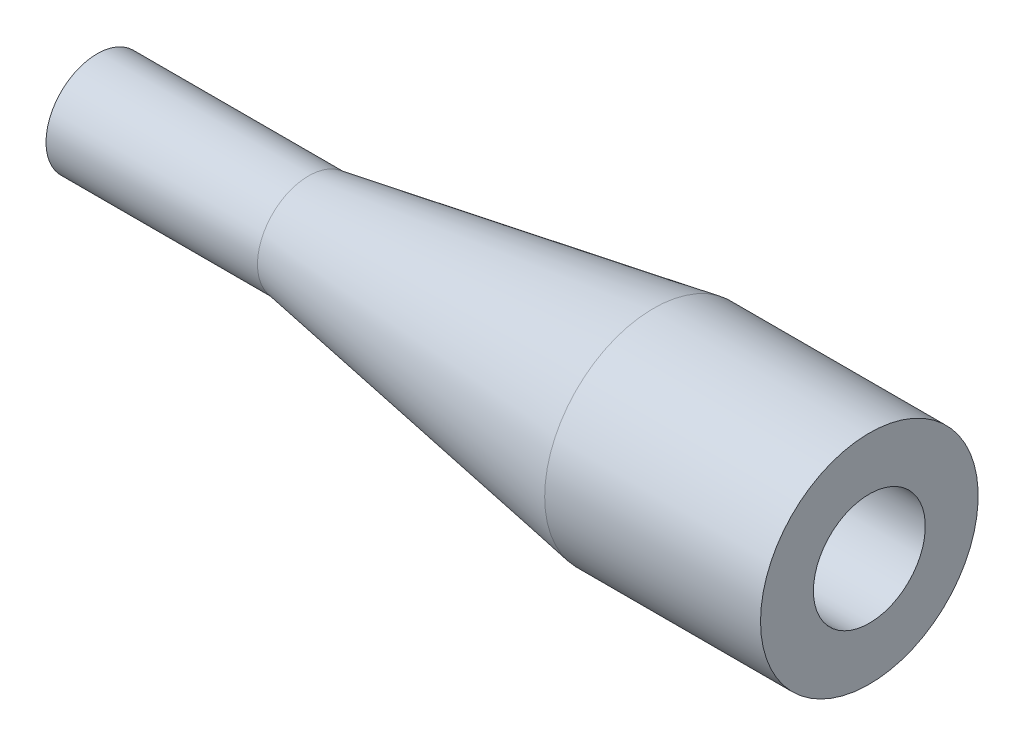
ISO-10303-21;
HEADER;
FILE_DESCRIPTION(('STEP AP214'),'2;1');
FILE_NAME('part.step','',(''),(''),'','','');
FILE_SCHEMA(('AUTOMOTIVE_DESIGN { 1 0 10303 214 1 1 1 1 }'));
ENDSEC;
DATA;
#1=APPLICATION_CONTEXT('core data for automotive mechanical design processes');
#2=APPLICATION_PROTOCOL_DEFINITION('international standard','automotive_design',2000,#1);
#3=PRODUCT_CONTEXT('',#1,'mechanical');
#4=PRODUCT('Part','Part','',(#3));
#5=PRODUCT_RELATED_PRODUCT_CATEGORY('part','',(#4));
#6=PRODUCT_DEFINITION_FORMATION('','',#4);
#7=PRODUCT_DEFINITION_CONTEXT('part definition',#1,'design');
#8=PRODUCT_DEFINITION('design','',#6,#7);
#9=PRODUCT_DEFINITION_SHAPE('','',#8);
#10=(LENGTH_UNIT() NAMED_UNIT(*) SI_UNIT(.MILLI.,.METRE.));
#11=(NAMED_UNIT(*) PLANE_ANGLE_UNIT() SI_UNIT($,.RADIAN.));
#12=(NAMED_UNIT(*) SI_UNIT($,.STERADIAN.) SOLID_ANGLE_UNIT());
#13=UNCERTAINTY_MEASURE_WITH_UNIT(LENGTH_MEASURE(1.E-05),#10,'distance_accuracy_value','');
#14=(GEOMETRIC_REPRESENTATION_CONTEXT(3) GLOBAL_UNCERTAINTY_ASSIGNED_CONTEXT((#13)) GLOBAL_UNIT_ASSIGNED_CONTEXT((#10,
#11,#12)) REPRESENTATION_CONTEXT('',''));
#15=CARTESIAN_POINT('',(0.,0.,0.));
#16=DIRECTION('',(0.,0.,1.));
#17=DIRECTION('',(1.,0.,0.));
#18=AXIS2_PLACEMENT_3D('',#15,#16,#17);
#19=CARTESIAN_POINT('',(0.,0.,-2.9));
#20=DIRECTION('',(1.,0.,0.));
#21=DIRECTION('',(0.,0.,-1.));
#22=AXIS2_PLACEMENT_3D('',#19,#20,#21);
#23=PLANE('',#22);
#24=CARTESIAN_POINT('',(0.,0.,0.));
#25=DIRECTION('',(-1.,0.,0.));
#26=DIRECTION('',(0.,0.,1.));
#27=AXIS2_PLACEMENT_3D('',#24,#25,#26);
#28=CIRCLE('',#27,0.9);
#29=CARTESIAN_POINT('',(0.,0.,0.9));
#30=VERTEX_POINT('',#29);
#31=EDGE_CURVE('E10',#30,#30,#28,.T.);
#32=ORIENTED_EDGE('',*,*,#31,.F.);
#33=EDGE_LOOP('',(#32));
#34=FACE_BOUND('',#33,.T.);
#35=CARTESIAN_POINT('',(0.,0.,0.));
#36=DIRECTION('',(-1.,0.,0.));
#37=DIRECTION('',(0.,0.,1.));
#38=AXIS2_PLACEMENT_3D('',#35,#36,#37);
#39=CIRCLE('',#38,2.9);
#40=CARTESIAN_POINT('',(0.,0.,2.9));
#41=VERTEX_POINT('',#40);
#42=EDGE_CURVE('E80',#41,#41,#39,.T.);
#43=ORIENTED_EDGE('',*,*,#42,.T.);
#44=EDGE_LOOP('',(#43));
#45=FACE_BOUND('',#44,.T.);
#46=ADVANCED_FACE('F41',(#34,#45),#23,.F.);
#47=CARTESIAN_POINT('',(0.,0.,0.));
#48=DIRECTION('',(-1.,0.,0.));
#49=DIRECTION('',(0.,0.,1.));
#50=AXIS2_PLACEMENT_3D('',#47,#48,#49);
#51=CYLINDRICAL_SURFACE('',#50,0.9);
#52=CARTESIAN_POINT('',(12.,0.,0.));
#53=DIRECTION('',(-1.,0.,0.));
#54=DIRECTION('',(0.,0.,1.));
#55=AXIS2_PLACEMENT_3D('',#52,#53,#54);
#56=CIRCLE('',#55,0.9);
#57=CARTESIAN_POINT('',(12.,0.,0.9));
#58=VERTEX_POINT('',#57);
#59=EDGE_CURVE('E48',#58,#58,#56,.T.);
#60=ORIENTED_EDGE('',*,*,#59,.F.);
#61=EDGE_LOOP('',(#60));
#62=FACE_BOUND('',#61,.T.);
#63=ORIENTED_EDGE('',*,*,#31,.T.);
#64=EDGE_LOOP('',(#63));
#65=FACE_BOUND('',#64,.T.);
#66=ADVANCED_FACE('F124',(#62,#65),#51,.F.);
#67=CARTESIAN_POINT('',(12.,0.,0.));
#68=DIRECTION('',(1.,0.,0.));
#69=DIRECTION('',(0.,0.,-1.));
#70=AXIS2_PLACEMENT_3D('',#67,#68,#69);
#71=CONICAL_SURFACE('',#70,0.9,0.0698131700797735);
#72=CARTESIAN_POINT('',(31.8207234318026,0.,0.));
#73=DIRECTION('',(-1.,0.,0.));
#74=DIRECTION('',(0.,0.,1.));
#75=AXIS2_PLACEMENT_3D('',#72,#73,#74);
#76=CIRCLE('',#75,2.286);
#77=CARTESIAN_POINT('',(31.8207234318026,0.,2.286));
#78=VERTEX_POINT('',#77);
#79=EDGE_CURVE('E53',#78,#78,#76,.T.);
#80=ORIENTED_EDGE('',*,*,#79,.F.);
#81=EDGE_LOOP('',(#80));
#82=FACE_BOUND('',#81,.T.);
#83=ORIENTED_EDGE('',*,*,#59,.T.);
#84=EDGE_LOOP('',(#83));
#85=FACE_BOUND('',#84,.T.);
#86=ADVANCED_FACE('F119',(#82,#85),#71,.F.);
#87=CARTESIAN_POINT('',(31.8207234318026,0.,-2.286));
#88=DIRECTION('',(-1.,0.,0.));
#89=DIRECTION('',(0.,0.,1.));
#90=AXIS2_PLACEMENT_3D('',#87,#88,#89);
#91=PLANE('',#90);
#92=CARTESIAN_POINT('',(31.8207234318026,0.,0.));
#93=DIRECTION('',(-1.,0.,0.));
#94=DIRECTION('',(0.,0.,1.));
#95=AXIS2_PLACEMENT_3D('',#92,#93,#94);
#96=CIRCLE('',#95,3.175);
#97=CARTESIAN_POINT('',(31.8207234318026,0.,3.175));
#98=VERTEX_POINT('',#97);
#99=EDGE_CURVE('E58',#98,#98,#96,.T.);
#100=ORIENTED_EDGE('',*,*,#99,.F.);
#101=EDGE_LOOP('',(#100));
#102=FACE_BOUND('',#101,.T.);
#103=ORIENTED_EDGE('',*,*,#79,.T.);
#104=EDGE_LOOP('',(#103));
#105=FACE_BOUND('',#104,.T.);
#106=ADVANCED_FACE('F113',(#102,#105),#91,.F.);
#107=CARTESIAN_POINT('',(0.,0.,0.));
#108=DIRECTION('',(-1.,0.,0.));
#109=DIRECTION('',(0.,0.,1.));
#110=AXIS2_PLACEMENT_3D('',#107,#108,#109);
#111=CYLINDRICAL_SURFACE('',#110,3.175);
#112=CARTESIAN_POINT('',(43.8207234318026,0.,0.));
#113=DIRECTION('',(-1.,0.,0.));
#114=DIRECTION('',(0.,0.,1.));
#115=AXIS2_PLACEMENT_3D('',#112,#113,#114);
#116=CIRCLE('',#115,3.175);
#117=CARTESIAN_POINT('',(43.8207234318026,0.,3.175));
#118=VERTEX_POINT('',#117);
#119=EDGE_CURVE('E64',#118,#118,#116,.T.);
#120=ORIENTED_EDGE('',*,*,#119,.F.);
#121=EDGE_LOOP('',(#120));
#122=FACE_BOUND('',#121,.T.);
#123=ORIENTED_EDGE('',*,*,#99,.T.);
#124=EDGE_LOOP('',(#123));
#125=FACE_BOUND('',#124,.T.);
#126=ADVANCED_FACE('F107',(#122,#125),#111,.F.);
#127=CARTESIAN_POINT('',(43.8207234318026,0.,-3.175));
#128=DIRECTION('',(-1.,0.,0.));
#129=DIRECTION('',(0.,0.,1.));
#130=AXIS2_PLACEMENT_3D('',#127,#128,#129);
#131=PLANE('',#130);
#132=CARTESIAN_POINT('',(43.8207234318026,0.,0.));
#133=DIRECTION('',(-1.,0.,0.));
#134=DIRECTION('',(0.,0.,1.));
#135=AXIS2_PLACEMENT_3D('',#132,#133,#134);
#136=CIRCLE('',#135,6.175);
#137=CARTESIAN_POINT('',(43.8207234318026,0.,6.175));
#138=VERTEX_POINT('',#137);
#139=EDGE_CURVE('E68',#138,#138,#136,.T.);
#140=ORIENTED_EDGE('',*,*,#139,.F.);
#141=EDGE_LOOP('',(#140));
#142=FACE_BOUND('',#141,.T.);
#143=ORIENTED_EDGE('',*,*,#119,.T.);
#144=EDGE_LOOP('',(#143));
#145=FACE_BOUND('',#144,.T.);
#146=ADVANCED_FACE('F101',(#142,#145),#131,.F.);
#147=CARTESIAN_POINT('',(0.,0.,0.));
#148=DIRECTION('',(-1.,0.,0.));
#149=DIRECTION('',(0.,0.,1.));
#150=AXIS2_PLACEMENT_3D('',#147,#148,#149);
#151=CYLINDRICAL_SURFACE('',#150,6.175);
#152=CARTESIAN_POINT('',(31.5714530154564,0.,0.));
#153=DIRECTION('',(-1.,0.,0.));
#154=DIRECTION('',(0.,0.,1.));
#155=AXIS2_PLACEMENT_3D('',#152,#153,#154);
#156=CIRCLE('',#155,6.175);
#157=CARTESIAN_POINT('',(31.5714530154564,0.,6.175));
#158=VERTEX_POINT('',#157);
#159=EDGE_CURVE('E72',#158,#158,#156,.T.);
#160=ORIENTED_EDGE('',*,*,#159,.F.);
#161=EDGE_LOOP('',(#160));
#162=FACE_BOUND('',#161,.T.);
#163=ORIENTED_EDGE('',*,*,#139,.T.);
#164=EDGE_LOOP('',(#163));
#165=FACE_BOUND('',#164,.T.);
#166=ADVANCED_FACE('F95',(#162,#165),#151,.T.);
#167=CARTESIAN_POINT('',(31.5714530154564,0.,0.));
#168=DIRECTION('',(1.,0.,0.));
#169=DIRECTION('',(0.,0.,-1.));
#170=AXIS2_PLACEMENT_3D('',#167,#168,#169);
#171=CONICAL_SURFACE('',#170,6.175,0.165799419369368);
#172=CARTESIAN_POINT('',(12.,0.,0.));
#173=DIRECTION('',(-1.,0.,0.));
#174=DIRECTION('',(0.,0.,1.));
#175=AXIS2_PLACEMENT_3D('',#172,#173,#174);
#176=CIRCLE('',#175,2.9);
#177=CARTESIAN_POINT('',(12.,0.,2.9));
#178=VERTEX_POINT('',#177);
#179=EDGE_CURVE('E76',#178,#178,#176,.T.);
#180=ORIENTED_EDGE('',*,*,#179,.F.);
#181=EDGE_LOOP('',(#180));
#182=FACE_BOUND('',#181,.T.);
#183=ORIENTED_EDGE('',*,*,#159,.T.);
#184=EDGE_LOOP('',(#183));
#185=FACE_BOUND('',#184,.T.);
#186=ADVANCED_FACE('F89',(#182,#185),#171,.T.);
#187=CARTESIAN_POINT('',(0.,0.,0.));
#188=DIRECTION('',(-1.,0.,0.));
#189=DIRECTION('',(0.,0.,1.));
#190=AXIS2_PLACEMENT_3D('',#187,#188,#189);
#191=CYLINDRICAL_SURFACE('',#190,2.9);
#192=ORIENTED_EDGE('',*,*,#42,.F.);
#193=EDGE_LOOP('',(#192));
#194=FACE_BOUND('',#193,.T.);
#195=ORIENTED_EDGE('',*,*,#179,.T.);
#196=EDGE_LOOP('',(#195));
#197=FACE_BOUND('',#196,.T.);
#198=ADVANCED_FACE('F86',(#194,#197),#191,.T.);
#199=CLOSED_SHELL('',(#46,#66,#86,#106,#126,#146,#166,#186,#198));
#200=MANIFOLD_SOLID_BREP('B2',#199);
#201=ADVANCED_BREP_SHAPE_REPRESENTATION('',(#18,#200),#14);
#202=SHAPE_DEFINITION_REPRESENTATION(#9,#201);
ENDSEC;
END-ISO-10303-21;
